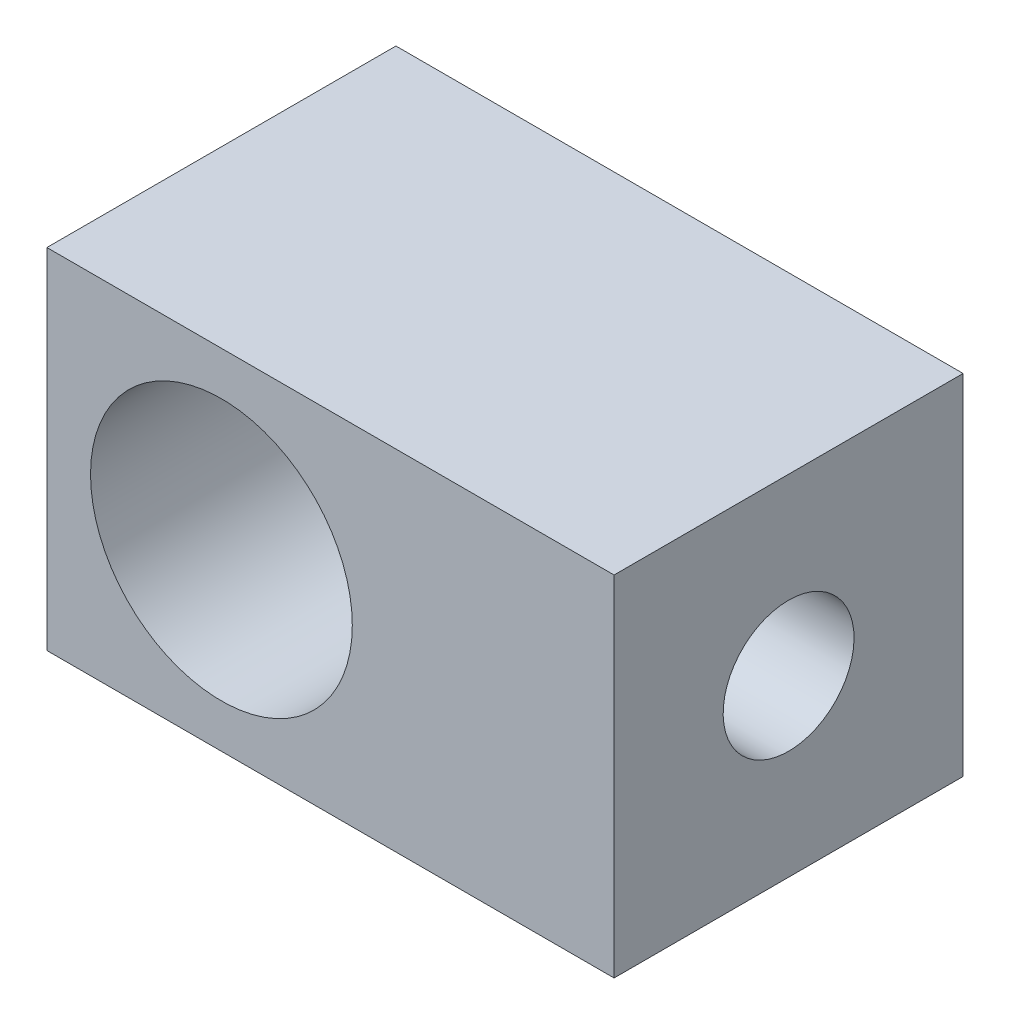
ISO-10303-21;
HEADER;
FILE_DESCRIPTION(('STEP AP214'),'2;1');
FILE_NAME('part.step','',(''),(''),'','','');
FILE_SCHEMA(('AUTOMOTIVE_DESIGN { 1 0 10303 214 1 1 1 1 }'));
ENDSEC;
DATA;
#1=APPLICATION_CONTEXT('core data for automotive mechanical design processes');
#2=APPLICATION_PROTOCOL_DEFINITION('international standard','automotive_design',2000,#1);
#3=PRODUCT_CONTEXT('',#1,'mechanical');
#4=PRODUCT('Part','Part','',(#3));
#5=PRODUCT_RELATED_PRODUCT_CATEGORY('part','',(#4));
#6=PRODUCT_DEFINITION_FORMATION('','',#4);
#7=PRODUCT_DEFINITION_CONTEXT('part definition',#1,'design');
#8=PRODUCT_DEFINITION('design','',#6,#7);
#9=PRODUCT_DEFINITION_SHAPE('','',#8);
#10=(LENGTH_UNIT() NAMED_UNIT(*) SI_UNIT(.MILLI.,.METRE.));
#11=(NAMED_UNIT(*) PLANE_ANGLE_UNIT() SI_UNIT($,.RADIAN.));
#12=(NAMED_UNIT(*) SI_UNIT($,.STERADIAN.) SOLID_ANGLE_UNIT());
#13=UNCERTAINTY_MEASURE_WITH_UNIT(LENGTH_MEASURE(1.E-05),#10,'distance_accuracy_value','');
#14=(GEOMETRIC_REPRESENTATION_CONTEXT(3) GLOBAL_UNCERTAINTY_ASSIGNED_CONTEXT((#13)) GLOBAL_UNIT_ASSIGNED_CONTEXT((#10,
#11,#12)) REPRESENTATION_CONTEXT('',''));
#15=CARTESIAN_POINT('',(0.,0.,0.));
#16=DIRECTION('',(0.,0.,1.));
#17=DIRECTION('',(1.,0.,0.));
#18=AXIS2_PLACEMENT_3D('',#15,#16,#17);
#19=CARTESIAN_POINT('',(4.62132034355964,0.,2.5));
#20=DIRECTION('',(0.707106781186541,-0.707106781186554,0.));
#21=DIRECTION('',(0.707106781186554,0.707106781186541,0.));
#22=AXIS2_PLACEMENT_3D('',#19,#20,#21);
#23=PLANE('',#22);
#24=DIRECTION('',(-0.707106781186554,-0.707106781186541,0.));
#25=VECTOR('',#24,1.);
#26=CARTESIAN_POINT('',(4.62132034355964,0.,2.5));
#27=LINE('',#26,#25);
#28=CARTESIAN_POINT('',(3.12132034355964,-1.5,2.5));
#29=VERTEX_POINT('',#28);
#30=CARTESIAN_POINT('',(2.49999999999998,-2.12132034355964,2.5));
#31=VERTEX_POINT('',#30);
#32=EDGE_CURVE('E254',#29,#31,#27,.T.);
#33=ORIENTED_EDGE('',*,*,#32,.F.);
#34=DIRECTION('',(0.,0.,-1.));
#35=VECTOR('',#34,1.);
#36=CARTESIAN_POINT('',(3.12132034355964,-1.5,2.5));
#37=LINE('',#36,#35);
#38=CARTESIAN_POINT('',(3.12132034355964,-1.5,2.));
#39=VERTEX_POINT('',#38);
#40=EDGE_CURVE('E227',#29,#39,#37,.T.);
#41=ORIENTED_EDGE('',*,*,#40,.T.);
#42=DIRECTION('',(-0.707106781186554,-0.707106781186541,0.));
#43=VECTOR('',#42,1.);
#44=CARTESIAN_POINT('',(2.49999999999998,-2.12132034355964,2.));
#45=LINE('',#44,#43);
#46=CARTESIAN_POINT('',(2.49999999999998,-2.12132034355964,2.));
#47=VERTEX_POINT('',#46);
#48=EDGE_CURVE('E235',#39,#47,#45,.T.);
#49=ORIENTED_EDGE('',*,*,#48,.T.);
#50=DIRECTION('',(0.,0.,-1.));
#51=VECTOR('',#50,1.);
#52=CARTESIAN_POINT('',(2.49999999999998,-2.12132034355964,2.5));
#53=LINE('',#52,#51);
#54=EDGE_CURVE('E272',#31,#47,#53,.T.);
#55=ORIENTED_EDGE('',*,*,#54,.F.);
#56=EDGE_LOOP('',(#33,#41,#49,#55));
#57=FACE_BOUND('',#56,.T.);
#58=ADVANCED_FACE('F33',(#57),#23,.F.);
#59=CARTESIAN_POINT('',(0.378679656440359,0.,2.5));
#60=DIRECTION('',(-0.707106781186554,-0.707106781186541,0.));
#61=DIRECTION('',(0.707106781186541,-0.707106781186554,0.));
#62=AXIS2_PLACEMENT_3D('',#59,#60,#61);
#63=PLANE('',#62);
#64=DIRECTION('',(-0.707106781186541,0.707106781186554,0.));
#65=VECTOR('',#64,1.);
#66=CARTESIAN_POINT('',(0.378679656440359,0.,2.5));
#67=LINE('',#66,#65);
#68=CARTESIAN_POINT('',(1.,-0.621320343559635,2.5));
#69=VERTEX_POINT('',#68);
#70=CARTESIAN_POINT('',(0.378679656440359,0.,2.5));
#71=VERTEX_POINT('',#70);
#72=EDGE_CURVE('E258',#69,#71,#67,.T.);
#73=ORIENTED_EDGE('',*,*,#72,.F.);
#74=DIRECTION('',(0.,0.,-1.));
#75=VECTOR('',#74,1.);
#76=CARTESIAN_POINT('',(1.,-0.621320343559636,2.5));
#77=LINE('',#76,#75);
#78=CARTESIAN_POINT('',(1.,-0.621320343559636,2.));
#79=VERTEX_POINT('',#78);
#80=EDGE_CURVE('E232',#69,#79,#77,.T.);
#81=ORIENTED_EDGE('',*,*,#80,.T.);
#82=DIRECTION('',(-0.707106781186541,0.707106781186554,0.));
#83=VECTOR('',#82,1.);
#84=CARTESIAN_POINT('',(0.378679656440359,0.,2.));
#85=LINE('',#84,#83);
#86=CARTESIAN_POINT('',(0.378679656440359,0.,2.));
#87=VERTEX_POINT('',#86);
#88=EDGE_CURVE('E239',#79,#87,#85,.T.);
#89=ORIENTED_EDGE('',*,*,#88,.T.);
#90=DIRECTION('',(0.,0.,-1.));
#91=VECTOR('',#90,1.);
#92=CARTESIAN_POINT('',(0.378679656440359,0.,2.5));
#93=LINE('',#92,#91);
#94=EDGE_CURVE('E269',#71,#87,#93,.T.);
#95=ORIENTED_EDGE('',*,*,#94,.F.);
#96=EDGE_LOOP('',(#73,#81,#89,#95));
#97=FACE_BOUND('',#96,.T.);
#98=ADVANCED_FACE('F374',(#97),#63,.F.);
#99=CARTESIAN_POINT('',(2.50000000000002,2.12132034355964,2.5));
#100=DIRECTION('',(-0.707106781186541,0.707106781186554,0.));
#101=DIRECTION('',(-0.707106781186554,-0.707106781186541,0.));
#102=AXIS2_PLACEMENT_3D('',#99,#100,#101);
#103=PLANE('',#102);
#104=DIRECTION('',(0.707106781186554,0.707106781186541,0.));
#105=VECTOR('',#104,1.);
#106=CARTESIAN_POINT('',(2.50000000000002,2.12132034355964,2.));
#107=LINE('',#106,#105);
#108=CARTESIAN_POINT('',(1.,0.621320343559651,2.));
#109=VERTEX_POINT('',#108);
#110=EDGE_CURVE('E244',#87,#109,#107,.T.);
#111=ORIENTED_EDGE('',*,*,#110,.T.);
#112=DIRECTION('',(0.,0.,1.));
#113=VECTOR('',#112,1.);
#114=CARTESIAN_POINT('',(1.,0.621320343559651,2.5));
#115=LINE('',#114,#113);
#116=CARTESIAN_POINT('',(1.,0.621320343559651,2.5));
#117=VERTEX_POINT('',#116);
#118=EDGE_CURVE('E230',#109,#117,#115,.T.);
#119=ORIENTED_EDGE('',*,*,#118,.T.);
#120=DIRECTION('',(0.707106781186554,0.707106781186541,0.));
#121=VECTOR('',#120,1.);
#122=CARTESIAN_POINT('',(2.50000000000002,2.12132034355964,2.5));
#123=LINE('',#122,#121);
#124=EDGE_CURVE('E177',#71,#117,#123,.T.);
#125=ORIENTED_EDGE('',*,*,#124,.F.);
#126=ORIENTED_EDGE('',*,*,#94,.T.);
#127=EDGE_LOOP('',(#111,#119,#125,#126));
#128=FACE_BOUND('',#127,.T.);
#129=ADVANCED_FACE('F380',(#128),#103,.F.);
#130=CARTESIAN_POINT('',(2.50000000000002,2.12132034355964,2.5));
#131=DIRECTION('',(0.707106781186554,0.707106781186542,0.));
#132=DIRECTION('',(-0.707106781186542,0.707106781186554,0.));
#133=AXIS2_PLACEMENT_3D('',#130,#131,#132);
#134=PLANE('',#133);
#135=DIRECTION('',(0.707106781186541,-0.707106781186553,0.));
#136=VECTOR('',#135,1.);
#137=CARTESIAN_POINT('',(2.50000000000002,2.12132034355964,2.5));
#138=LINE('',#137,#136);
#139=CARTESIAN_POINT('',(4.,0.621320343559634,2.5));
#140=VERTEX_POINT('',#139);
#141=CARTESIAN_POINT('',(4.62132034355964,0.,2.5));
#142=VERTEX_POINT('',#141);
#143=EDGE_CURVE('E251',#140,#142,#138,.T.);
#144=ORIENTED_EDGE('',*,*,#143,.F.);
#145=DIRECTION('',(0.,0.,-1.));
#146=VECTOR('',#145,1.);
#147=CARTESIAN_POINT('',(4.,0.621320343559635,2.5));
#148=LINE('',#147,#146);
#149=CARTESIAN_POINT('',(4.,0.621320343559635,2.));
#150=VERTEX_POINT('',#149);
#151=EDGE_CURVE('E218',#140,#150,#148,.T.);
#152=ORIENTED_EDGE('',*,*,#151,.T.);
#153=DIRECTION('',(0.707106781186541,-0.707106781186553,0.));
#154=VECTOR('',#153,1.);
#155=CARTESIAN_POINT('',(4.62132034355964,0.,2.));
#156=LINE('',#155,#154);
#157=CARTESIAN_POINT('',(4.62132034355964,0.,2.));
#158=VERTEX_POINT('',#157);
#159=EDGE_CURVE('E247',#150,#158,#156,.T.);
#160=ORIENTED_EDGE('',*,*,#159,.T.);
#161=DIRECTION('',(0.,0.,-1.));
#162=VECTOR('',#161,1.);
#163=CARTESIAN_POINT('',(4.62132034355964,0.,2.5));
#164=LINE('',#163,#162);
#165=EDGE_CURVE('E264',#142,#158,#164,.T.);
#166=ORIENTED_EDGE('',*,*,#165,.F.);
#167=EDGE_LOOP('',(#144,#152,#160,#166));
#168=FACE_BOUND('',#167,.T.);
#169=ADVANCED_FACE('F350',(#168),#134,.F.);
#170=CARTESIAN_POINT('',(0.,0.,2.));
#171=DIRECTION('',(0.,0.,1.));
#172=DIRECTION('',(1.,0.,0.));
#173=AXIS2_PLACEMENT_3D('',#170,#171,#172);
#174=PLANE('',#173);
#175=DIRECTION('',(0.,-1.,0.));
#176=VECTOR('',#175,1.);
#177=CARTESIAN_POINT('',(1.,0.,2.));
#178=LINE('',#177,#176);
#179=EDGE_CURVE('E11',#109,#79,#178,.T.);
#180=ORIENTED_EDGE('',*,*,#179,.F.);
#181=ORIENTED_EDGE('',*,*,#110,.F.);
#182=ORIENTED_EDGE('',*,*,#88,.F.);
#183=EDGE_LOOP('',(#180,#181,#182));
#184=FACE_BOUND('',#183,.T.);
#185=ADVANCED_FACE('F368',(#184),#174,.T.);
#186=DIRECTION('',(1.,0.,0.));
#187=VECTOR('',#186,1.);
#188=CARTESIAN_POINT('',(0.,-1.5,2.));
#189=LINE('',#188,#187);
#190=CARTESIAN_POINT('',(1.87867965644035,-1.5,2.));
#191=VERTEX_POINT('',#190);
#192=EDGE_CURVE('E41',#191,#39,#189,.T.);
#193=ORIENTED_EDGE('',*,*,#192,.F.);
#194=EDGE_CURVE('E240',#47,#191,#85,.T.);
#195=ORIENTED_EDGE('',*,*,#194,.F.);
#196=ORIENTED_EDGE('',*,*,#48,.F.);
#197=EDGE_LOOP('',(#193,#195,#196));
#198=FACE_BOUND('',#197,.T.);
#199=ADVANCED_FACE('F331',(#198),#174,.T.);
#200=DIRECTION('',(0.,1.,0.));
#201=VECTOR('',#200,1.);
#202=CARTESIAN_POINT('',(4.,0.,2.));
#203=LINE('',#202,#201);
#204=CARTESIAN_POINT('',(4.,-0.62132034355965,2.));
#205=VERTEX_POINT('',#204);
#206=EDGE_CURVE('E320',#205,#150,#203,.T.);
#207=ORIENTED_EDGE('',*,*,#206,.F.);
#208=EDGE_CURVE('E236',#158,#205,#45,.T.);
#209=ORIENTED_EDGE('',*,*,#208,.F.);
#210=ORIENTED_EDGE('',*,*,#159,.F.);
#211=EDGE_LOOP('',(#207,#209,#210));
#212=FACE_BOUND('',#211,.T.);
#213=ADVANCED_FACE('F358',(#212),#174,.T.);
#214=CARTESIAN_POINT('',(0.,0.,2.5));
#215=DIRECTION('',(0.,0.,-1.));
#216=DIRECTION('',(-1.,0.,0.));
#217=AXIS2_PLACEMENT_3D('',#214,#215,#216);
#218=PLANE('',#217);
#219=CARTESIAN_POINT('',(2.50000000000002,2.12132034355964,2.5));
#220=VERTEX_POINT('',#219);
#221=CARTESIAN_POINT('',(3.12132034355965,1.5,2.5));
#222=VERTEX_POINT('',#221);
#223=EDGE_CURVE('E252',#220,#222,#138,.T.);
#224=ORIENTED_EDGE('',*,*,#223,.T.);
#225=DIRECTION('',(1.,0.,0.));
#226=VECTOR('',#225,1.);
#227=CARTESIAN_POINT('',(4.,1.5,2.5));
#228=LINE('',#227,#226);
#229=CARTESIAN_POINT('',(4.,1.5,2.5));
#230=VERTEX_POINT('',#229);
#231=EDGE_CURVE('E194',#222,#230,#228,.T.);
#232=ORIENTED_EDGE('',*,*,#231,.T.);
#233=DIRECTION('',(0.,-1.,0.));
#234=VECTOR('',#233,1.);
#235=CARTESIAN_POINT('',(4.,1.5,2.5));
#236=LINE('',#235,#234);
#237=EDGE_CURVE('E196',#230,#140,#236,.T.);
#238=ORIENTED_EDGE('',*,*,#237,.T.);
#239=ORIENTED_EDGE('',*,*,#143,.T.);
#240=CARTESIAN_POINT('',(4.,-0.62132034355965,2.5));
#241=VERTEX_POINT('',#240);
#242=EDGE_CURVE('E255',#142,#241,#27,.T.);
#243=ORIENTED_EDGE('',*,*,#242,.T.);
#244=CARTESIAN_POINT('',(4.,-1.5,2.5));
#245=VERTEX_POINT('',#244);
#246=EDGE_CURVE('E193',#241,#245,#236,.T.);
#247=ORIENTED_EDGE('',*,*,#246,.T.);
#248=DIRECTION('',(-1.,0.,0.));
#249=VECTOR('',#248,1.);
#250=CARTESIAN_POINT('',(4.,-1.5,2.5));
#251=LINE('',#250,#249);
#252=EDGE_CURVE('E188',#245,#29,#251,.T.);
#253=ORIENTED_EDGE('',*,*,#252,.T.);
#254=ORIENTED_EDGE('',*,*,#32,.T.);
#255=CARTESIAN_POINT('',(1.87867965644035,-1.5,2.5));
#256=VERTEX_POINT('',#255);
#257=EDGE_CURVE('E259',#31,#256,#67,.T.);
#258=ORIENTED_EDGE('',*,*,#257,.T.);
#259=CARTESIAN_POINT('',(1.,-1.5,2.5));
#260=VERTEX_POINT('',#259);
#261=EDGE_CURVE('E200',#256,#260,#251,.T.);
#262=ORIENTED_EDGE('',*,*,#261,.T.);
#263=DIRECTION('',(0.,1.,0.));
#264=VECTOR('',#263,1.);
#265=CARTESIAN_POINT('',(1.,1.5,2.5));
#266=LINE('',#265,#264);
#267=EDGE_CURVE('E179',#260,#69,#266,.T.);
#268=ORIENTED_EDGE('',*,*,#267,.T.);
#269=ORIENTED_EDGE('',*,*,#72,.T.);
#270=ORIENTED_EDGE('',*,*,#124,.T.);
#271=CARTESIAN_POINT('',(1.,1.5,2.5));
#272=VERTEX_POINT('',#271);
#273=EDGE_CURVE('E170',#117,#272,#266,.T.);
#274=ORIENTED_EDGE('',*,*,#273,.T.);
#275=CARTESIAN_POINT('',(1.87867965644037,1.5,2.5));
#276=VERTEX_POINT('',#275);
#277=EDGE_CURVE('E174',#272,#276,#228,.T.);
#278=ORIENTED_EDGE('',*,*,#277,.T.);
#279=EDGE_CURVE('E262',#276,#220,#123,.T.);
#280=ORIENTED_EDGE('',*,*,#279,.T.);
#281=EDGE_LOOP('',(#224,#232,#238,#239,#243,#247,#253,#254,#258,#262,#268,#269,#270,#274,#278,#280));
#282=FACE_BOUND('',#281,.T.);
#283=ADVANCED_FACE('F172',(#282),#218,.T.);
#284=ORIENTED_EDGE('',*,*,#208,.T.);
#285=DIRECTION('',(0.,0.,1.));
#286=VECTOR('',#285,1.);
#287=CARTESIAN_POINT('',(4.,-0.62132034355965,2.5));
#288=LINE('',#287,#286);
#289=EDGE_CURVE('E221',#205,#241,#288,.T.);
#290=ORIENTED_EDGE('',*,*,#289,.T.);
#291=ORIENTED_EDGE('',*,*,#242,.F.);
#292=ORIENTED_EDGE('',*,*,#165,.T.);
#293=EDGE_LOOP('',(#284,#290,#291,#292));
#294=FACE_BOUND('',#293,.T.);
#295=ADVANCED_FACE('F355',(#294),#23,.F.);
#296=ORIENTED_EDGE('',*,*,#194,.T.);
#297=DIRECTION('',(0.,0.,1.));
#298=VECTOR('',#297,1.);
#299=CARTESIAN_POINT('',(1.87867965644035,-1.5,2.5));
#300=LINE('',#299,#298);
#301=EDGE_CURVE('E224',#191,#256,#300,.T.);
#302=ORIENTED_EDGE('',*,*,#301,.T.);
#303=ORIENTED_EDGE('',*,*,#257,.F.);
#304=ORIENTED_EDGE('',*,*,#54,.T.);
#305=EDGE_LOOP('',(#296,#302,#303,#304));
#306=FACE_BOUND('',#305,.T.);
#307=ADVANCED_FACE('F334',(#306),#63,.F.);
#308=ORIENTED_EDGE('',*,*,#279,.F.);
#309=DIRECTION('',(0.,0.,-1.));
#310=VECTOR('',#309,1.);
#311=CARTESIAN_POINT('',(1.87867965644037,1.5,2.5));
#312=LINE('',#311,#310);
#313=CARTESIAN_POINT('',(1.87867965644037,1.5,2.));
#314=VERTEX_POINT('',#313);
#315=EDGE_CURVE('E192',#276,#314,#312,.T.);
#316=ORIENTED_EDGE('',*,*,#315,.T.);
#317=CARTESIAN_POINT('',(2.50000000000002,2.12132034355964,2.));
#318=VERTEX_POINT('',#317);
#319=EDGE_CURVE('E243',#314,#318,#107,.T.);
#320=ORIENTED_EDGE('',*,*,#319,.T.);
#321=DIRECTION('',(0.,0.,-1.));
#322=VECTOR('',#321,1.);
#323=CARTESIAN_POINT('',(2.50000000000002,2.12132034355964,2.5));
#324=LINE('',#323,#322);
#325=EDGE_CURVE('E265',#220,#318,#324,.T.);
#326=ORIENTED_EDGE('',*,*,#325,.F.);
#327=EDGE_LOOP('',(#308,#316,#320,#326));
#328=FACE_BOUND('',#327,.T.);
#329=ADVANCED_FACE('F388',(#328),#103,.F.);
#330=CARTESIAN_POINT('',(3.12132034355965,1.5,2.));
#331=VERTEX_POINT('',#330);
#332=EDGE_CURVE('E248',#318,#331,#156,.T.);
#333=ORIENTED_EDGE('',*,*,#332,.T.);
#334=DIRECTION('',(0.,0.,1.));
#335=VECTOR('',#334,1.);
#336=CARTESIAN_POINT('',(3.12132034355965,1.5,2.5));
#337=LINE('',#336,#335);
#338=EDGE_CURVE('E56',#331,#222,#337,.T.);
#339=ORIENTED_EDGE('',*,*,#338,.T.);
#340=ORIENTED_EDGE('',*,*,#223,.F.);
#341=ORIENTED_EDGE('',*,*,#325,.T.);
#342=EDGE_LOOP('',(#333,#339,#340,#341));
#343=FACE_BOUND('',#342,.T.);
#344=ADVANCED_FACE('F371',(#343),#134,.F.);
#345=DIRECTION('',(-1.,0.,0.));
#346=VECTOR('',#345,1.);
#347=CARTESIAN_POINT('',(0.,1.5,2.));
#348=LINE('',#347,#346);
#349=EDGE_CURVE('E318',#331,#314,#348,.T.);
#350=ORIENTED_EDGE('',*,*,#349,.F.);
#351=ORIENTED_EDGE('',*,*,#332,.F.);
#352=ORIENTED_EDGE('',*,*,#319,.F.);
#353=EDGE_LOOP('',(#350,#351,#352));
#354=FACE_BOUND('',#353,.T.);
#355=ADVANCED_FACE('F361',(#354),#174,.T.);
#356=CARTESIAN_POINT('',(1.,1.5,2.5));
#357=DIRECTION('',(-1.,0.,0.));
#358=DIRECTION('',(0.,-1.,0.));
#359=AXIS2_PLACEMENT_3D('',#356,#357,#358);
#360=PLANE('',#359);
#361=ORIENTED_EDGE('',*,*,#267,.F.);
#362=DIRECTION('',(0.,0.,-1.));
#363=VECTOR('',#362,1.);
#364=CARTESIAN_POINT('',(1.,-1.5,2.5));
#365=LINE('',#364,#363);
#366=CARTESIAN_POINT('',(1.,-1.5,0.));
#367=VERTEX_POINT('',#366);
#368=EDGE_CURVE('E211',#260,#367,#365,.T.);
#369=ORIENTED_EDGE('',*,*,#368,.T.);
#370=DIRECTION('',(0.,1.,0.));
#371=VECTOR('',#370,1.);
#372=CARTESIAN_POINT('',(1.,1.5,0.));
#373=LINE('',#372,#371);
#374=CARTESIAN_POINT('',(1.,1.5,0.));
#375=VERTEX_POINT('',#374);
#376=EDGE_CURVE('E48',#367,#375,#373,.T.);
#377=ORIENTED_EDGE('',*,*,#376,.T.);
#378=DIRECTION('',(0.,0.,-1.));
#379=VECTOR('',#378,1.);
#380=CARTESIAN_POINT('',(1.,1.5,2.5));
#381=LINE('',#380,#379);
#382=EDGE_CURVE('E182',#272,#375,#381,.T.);
#383=ORIENTED_EDGE('',*,*,#382,.F.);
#384=ORIENTED_EDGE('',*,*,#273,.F.);
#385=ORIENTED_EDGE('',*,*,#118,.F.);
#386=ORIENTED_EDGE('',*,*,#179,.T.);
#387=ORIENTED_EDGE('',*,*,#80,.F.);
#388=EDGE_LOOP('',(#361,#369,#377,#383,#384,#385,#386,#387));
#389=FACE_BOUND('',#388,.T.);
#390=ADVANCED_FACE('F184',(#389),#360,.F.);
#391=CARTESIAN_POINT('',(4.,-1.5,2.5));
#392=DIRECTION('',(0.,-1.,0.));
#393=DIRECTION('',(0.,0.,-1.));
#394=AXIS2_PLACEMENT_3D('',#391,#392,#393);
#395=PLANE('',#394);
#396=ORIENTED_EDGE('',*,*,#252,.F.);
#397=DIRECTION('',(0.,0.,-1.));
#398=VECTOR('',#397,1.);
#399=CARTESIAN_POINT('',(4.,-1.5,2.5));
#400=LINE('',#399,#398);
#401=CARTESIAN_POINT('',(4.,-1.5,0.));
#402=VERTEX_POINT('',#401);
#403=EDGE_CURVE('E213',#245,#402,#400,.T.);
#404=ORIENTED_EDGE('',*,*,#403,.T.);
#405=DIRECTION('',(-1.,0.,0.));
#406=VECTOR('',#405,1.);
#407=CARTESIAN_POINT('',(4.,-1.5,0.));
#408=LINE('',#407,#406);
#409=EDGE_CURVE('E180',#402,#367,#408,.T.);
#410=ORIENTED_EDGE('',*,*,#409,.T.);
#411=ORIENTED_EDGE('',*,*,#368,.F.);
#412=ORIENTED_EDGE('',*,*,#261,.F.);
#413=ORIENTED_EDGE('',*,*,#301,.F.);
#414=ORIENTED_EDGE('',*,*,#192,.T.);
#415=ORIENTED_EDGE('',*,*,#40,.F.);
#416=EDGE_LOOP('',(#396,#404,#410,#411,#412,#413,#414,#415));
#417=FACE_BOUND('',#416,.T.);
#418=ADVANCED_FACE('F324',(#417),#395,.F.);
#419=CARTESIAN_POINT('',(4.,1.5,2.5));
#420=DIRECTION('',(1.,0.,0.));
#421=DIRECTION('',(0.,0.,-1.));
#422=AXIS2_PLACEMENT_3D('',#419,#420,#421);
#423=PLANE('',#422);
#424=ORIENTED_EDGE('',*,*,#206,.T.);
#425=ORIENTED_EDGE('',*,*,#151,.F.);
#426=ORIENTED_EDGE('',*,*,#237,.F.);
#427=DIRECTION('',(0.,0.,-1.));
#428=VECTOR('',#427,1.);
#429=CARTESIAN_POINT('',(4.,1.5,2.5));
#430=LINE('',#429,#428);
#431=CARTESIAN_POINT('',(4.,1.5,0.));
#432=VERTEX_POINT('',#431);
#433=EDGE_CURVE('E187',#230,#432,#430,.T.);
#434=ORIENTED_EDGE('',*,*,#433,.T.);
#435=DIRECTION('',(0.,-1.,0.));
#436=VECTOR('',#435,1.);
#437=CARTESIAN_POINT('',(4.,1.5,0.));
#438=LINE('',#437,#436);
#439=EDGE_CURVE('E206',#432,#402,#438,.T.);
#440=ORIENTED_EDGE('',*,*,#439,.T.);
#441=ORIENTED_EDGE('',*,*,#403,.F.);
#442=ORIENTED_EDGE('',*,*,#246,.F.);
#443=ORIENTED_EDGE('',*,*,#289,.F.);
#444=EDGE_LOOP('',(#424,#425,#426,#434,#440,#441,#442,#443));
#445=FACE_BOUND('',#444,.T.);
#446=ADVANCED_FACE('F341',(#445),#423,.F.);
#447=CARTESIAN_POINT('',(4.,1.5,2.5));
#448=DIRECTION('',(0.,1.,0.));
#449=DIRECTION('',(0.,0.,1.));
#450=AXIS2_PLACEMENT_3D('',#447,#448,#449);
#451=PLANE('',#450);
#452=ORIENTED_EDGE('',*,*,#277,.F.);
#453=ORIENTED_EDGE('',*,*,#382,.T.);
#454=DIRECTION('',(1.,0.,0.));
#455=VECTOR('',#454,1.);
#456=CARTESIAN_POINT('',(4.,1.5,0.));
#457=LINE('',#456,#455);
#458=EDGE_CURVE('E204',#375,#432,#457,.T.);
#459=ORIENTED_EDGE('',*,*,#458,.T.);
#460=ORIENTED_EDGE('',*,*,#433,.F.);
#461=ORIENTED_EDGE('',*,*,#231,.F.);
#462=ORIENTED_EDGE('',*,*,#338,.F.);
#463=ORIENTED_EDGE('',*,*,#349,.T.);
#464=ORIENTED_EDGE('',*,*,#315,.F.);
#465=EDGE_LOOP('',(#452,#453,#459,#460,#461,#462,#463,#464));
#466=FACE_BOUND('',#465,.T.);
#467=ADVANCED_FACE('F190',(#466),#451,.F.);
#468=CARTESIAN_POINT('',(-4.,4.,8.));
#469=DIRECTION('',(0.,-1.,0.));
#470=DIRECTION('',(0.,0.,-1.));
#471=AXIS2_PLACEMENT_3D('',#468,#469,#470);
#472=PLANE('',#471);
#473=DIRECTION('',(-1.,0.,0.));
#474=VECTOR('',#473,1.);
#475=CARTESIAN_POINT('',(-4.,4.,0.));
#476=LINE('',#475,#474);
#477=CARTESIAN_POINT('',(9.,4.,0.));
#478=VERTEX_POINT('',#477);
#479=CARTESIAN_POINT('',(-4.,4.,0.));
#480=VERTEX_POINT('',#479);
#481=EDGE_CURVE('E298',#478,#480,#476,.T.);
#482=ORIENTED_EDGE('',*,*,#481,.T.);
#483=DIRECTION('',(0.,0.,-1.));
#484=VECTOR('',#483,1.);
#485=CARTESIAN_POINT('',(-4.,4.,8.));
#486=LINE('',#485,#484);
#487=CARTESIAN_POINT('',(-4.,4.,8.));
#488=VERTEX_POINT('',#487);
#489=EDGE_CURVE('E315',#488,#480,#486,.T.);
#490=ORIENTED_EDGE('',*,*,#489,.F.);
#491=DIRECTION('',(-1.,0.,0.));
#492=VECTOR('',#491,1.);
#493=CARTESIAN_POINT('',(-4.,4.,8.));
#494=LINE('',#493,#492);
#495=CARTESIAN_POINT('',(9.,4.,8.));
#496=VERTEX_POINT('',#495);
#497=EDGE_CURVE('E301',#496,#488,#494,.T.);
#498=ORIENTED_EDGE('',*,*,#497,.F.);
#499=DIRECTION('',(0.,0.,1.));
#500=VECTOR('',#499,1.);
#501=CARTESIAN_POINT('',(9.,4.,0.));
#502=LINE('',#501,#500);
#503=EDGE_CURVE('E280',#478,#496,#502,.T.);
#504=ORIENTED_EDGE('',*,*,#503,.F.);
#505=EDGE_LOOP('',(#482,#490,#498,#504));
#506=FACE_BOUND('',#505,.T.);
#507=ADVANCED_FACE('F35',(#506),#472,.F.);
#508=CARTESIAN_POINT('',(-4.,4.,8.));
#509=DIRECTION('',(1.,0.,0.));
#510=DIRECTION('',(0.,1.,0.));
#511=AXIS2_PLACEMENT_3D('',#508,#509,#510);
#512=PLANE('',#511);
#513=DIRECTION('',(0.,-1.,0.));
#514=VECTOR('',#513,1.);
#515=CARTESIAN_POINT('',(-4.,4.,0.));
#516=LINE('',#515,#514);
#517=CARTESIAN_POINT('',(-4.,-4.,0.));
#518=VERTEX_POINT('',#517);
#519=EDGE_CURVE('E310',#480,#518,#516,.T.);
#520=ORIENTED_EDGE('',*,*,#519,.T.);
#521=DIRECTION('',(0.,0.,-1.));
#522=VECTOR('',#521,1.);
#523=CARTESIAN_POINT('',(-4.,-4.,8.));
#524=LINE('',#523,#522);
#525=CARTESIAN_POINT('',(-4.,-4.,8.));
#526=VERTEX_POINT('',#525);
#527=EDGE_CURVE('E308',#526,#518,#524,.T.);
#528=ORIENTED_EDGE('',*,*,#527,.F.);
#529=DIRECTION('',(0.,-1.,0.));
#530=VECTOR('',#529,1.);
#531=CARTESIAN_POINT('',(-4.,4.,8.));
#532=LINE('',#531,#530);
#533=EDGE_CURVE('E303',#488,#526,#532,.T.);
#534=ORIENTED_EDGE('',*,*,#533,.F.);
#535=ORIENTED_EDGE('',*,*,#489,.T.);
#536=EDGE_LOOP('',(#520,#528,#534,#535));
#537=FACE_BOUND('',#536,.T.);
#538=ADVANCED_FACE('F562',(#537),#512,.F.);
#539=CARTESIAN_POINT('',(-4.,-4.,8.));
#540=DIRECTION('',(0.,1.,0.));
#541=DIRECTION('',(0.,0.,1.));
#542=AXIS2_PLACEMENT_3D('',#539,#540,#541);
#543=PLANE('',#542);
#544=DIRECTION('',(1.,0.,0.));
#545=VECTOR('',#544,1.);
#546=CARTESIAN_POINT('',(-4.,-4.,0.));
#547=LINE('',#546,#545);
#548=CARTESIAN_POINT('',(9.,-4.,0.));
#549=VERTEX_POINT('',#548);
#550=EDGE_CURVE('E304',#518,#549,#547,.T.);
#551=ORIENTED_EDGE('',*,*,#550,.T.);
#552=DIRECTION('',(0.,0.,-1.));
#553=VECTOR('',#552,1.);
#554=CARTESIAN_POINT('',(9.,-4.,8.));
#555=LINE('',#554,#553);
#556=CARTESIAN_POINT('',(9.,-4.,8.));
#557=VERTEX_POINT('',#556);
#558=EDGE_CURVE('E288',#557,#549,#555,.T.);
#559=ORIENTED_EDGE('',*,*,#558,.F.);
#560=DIRECTION('',(1.,0.,0.));
#561=VECTOR('',#560,1.);
#562=CARTESIAN_POINT('',(-4.,-4.,8.));
#563=LINE('',#562,#561);
#564=EDGE_CURVE('E306',#526,#557,#563,.T.);
#565=ORIENTED_EDGE('',*,*,#564,.F.);
#566=ORIENTED_EDGE('',*,*,#527,.T.);
#567=EDGE_LOOP('',(#551,#559,#565,#566));
#568=FACE_BOUND('',#567,.T.);
#569=ADVANCED_FACE('F554',(#568),#543,.F.);
#570=CARTESIAN_POINT('',(0.,0.,8.));
#571=DIRECTION('',(0.,0.,1.));
#572=DIRECTION('',(1.,0.,0.));
#573=AXIS2_PLACEMENT_3D('',#570,#571,#572);
#574=PLANE('',#573);
#575=CARTESIAN_POINT('',(0.,0.,8.));
#576=DIRECTION('',(0.,0.,1.));
#577=DIRECTION('',(1.,0.,0.));
#578=AXIS2_PLACEMENT_3D('',#575,#576,#577);
#579=CIRCLE('',#578,3.);
#580=CARTESIAN_POINT('',(3.,0.,8.));
#581=VERTEX_POINT('',#580);
#582=EDGE_CURVE('E294',#581,#581,#579,.T.);
#583=ORIENTED_EDGE('',*,*,#582,.F.);
#584=EDGE_LOOP('',(#583));
#585=FACE_BOUND('',#584,.T.);
#586=ORIENTED_EDGE('',*,*,#564,.T.);
#587=DIRECTION('',(0.,-1.,0.));
#588=VECTOR('',#587,1.);
#589=CARTESIAN_POINT('',(9.,4.,8.));
#590=LINE('',#589,#588);
#591=EDGE_CURVE('E285',#496,#557,#590,.T.);
#592=ORIENTED_EDGE('',*,*,#591,.F.);
#593=ORIENTED_EDGE('',*,*,#497,.T.);
#594=ORIENTED_EDGE('',*,*,#533,.T.);
#595=EDGE_LOOP('',(#586,#592,#593,#594));
#596=FACE_BOUND('',#595,.T.);
#597=ADVANCED_FACE('F474',(#585,#596),#574,.T.);
#598=CARTESIAN_POINT('',(0.,0.,0.));
#599=DIRECTION('',(0.,0.,1.));
#600=DIRECTION('',(1.,0.,0.));
#601=AXIS2_PLACEMENT_3D('',#598,#599,#600);
#602=PLANE('',#601);
#603=ORIENTED_EDGE('',*,*,#458,.F.);
#604=ORIENTED_EDGE('',*,*,#376,.F.);
#605=ORIENTED_EDGE('',*,*,#409,.F.);
#606=ORIENTED_EDGE('',*,*,#439,.F.);
#607=EDGE_LOOP('',(#603,#604,#605,#606));
#608=FACE_BOUND('',#607,.T.);
#609=ORIENTED_EDGE('',*,*,#481,.F.);
#610=DIRECTION('',(0.,1.,0.));
#611=VECTOR('',#610,1.);
#612=CARTESIAN_POINT('',(9.,-4.,0.));
#613=LINE('',#612,#611);
#614=EDGE_CURVE('E291',#549,#478,#613,.T.);
#615=ORIENTED_EDGE('',*,*,#614,.F.);
#616=ORIENTED_EDGE('',*,*,#550,.F.);
#617=ORIENTED_EDGE('',*,*,#519,.F.);
#618=EDGE_LOOP('',(#609,#615,#616,#617));
#619=FACE_BOUND('',#618,.T.);
#620=ADVANCED_FACE('F345',(#608,#619),#602,.F.);
#621=CARTESIAN_POINT('',(0.,0.,3.));
#622=DIRECTION('',(0.,0.,1.));
#623=DIRECTION('',(1.,0.,0.));
#624=AXIS2_PLACEMENT_3D('',#621,#622,#623);
#625=CYLINDRICAL_SURFACE('',#624,3.);
#626=CARTESIAN_POINT('',(0.,0.,3.));
#627=DIRECTION('',(0.,0.,1.));
#628=DIRECTION('',(1.,0.,0.));
#629=AXIS2_PLACEMENT_3D('',#626,#627,#628);
#630=CIRCLE('',#629,3.);
#631=CARTESIAN_POINT('',(3.,0.,3.));
#632=VERTEX_POINT('',#631);
#633=EDGE_CURVE('E295',#632,#632,#630,.T.);
#634=ORIENTED_EDGE('',*,*,#633,.F.);
#635=EDGE_LOOP('',(#634));
#636=FACE_BOUND('',#635,.T.);
#637=ORIENTED_EDGE('',*,*,#582,.T.);
#638=EDGE_LOOP('',(#637));
#639=FACE_BOUND('',#638,.T.);
#640=ADVANCED_FACE('F473',(#636,#639),#625,.F.);
#641=CARTESIAN_POINT('',(0.,0.,3.));
#642=DIRECTION('',(0.,0.,1.));
#643=DIRECTION('',(1.,0.,0.));
#644=AXIS2_PLACEMENT_3D('',#641,#642,#643);
#645=PLANE('',#644);
#646=ORIENTED_EDGE('',*,*,#633,.T.);
#647=EDGE_LOOP('',(#646));
#648=FACE_BOUND('',#647,.T.);
#649=ADVANCED_FACE('F530',(#648),#645,.T.);
#650=CARTESIAN_POINT('',(9.,0.,0.));
#651=DIRECTION('',(1.,0.,0.));
#652=DIRECTION('',(0.,1.,0.));
#653=AXIS2_PLACEMENT_3D('',#650,#651,#652);
#654=PLANE('',#653);
#655=CARTESIAN_POINT('',(9.,0.,4.));
#656=DIRECTION('',(1.,0.,0.));
#657=DIRECTION('',(0.,1.,0.));
#658=AXIS2_PLACEMENT_3D('',#655,#656,#657);
#659=CIRCLE('',#658,1.5);
#660=CARTESIAN_POINT('',(9.,1.5,4.));
#661=VERTEX_POINT('',#660);
#662=EDGE_CURVE('E268',#661,#661,#659,.T.);
#663=ORIENTED_EDGE('',*,*,#662,.F.);
#664=EDGE_LOOP('',(#663));
#665=FACE_BOUND('',#664,.T.);
#666=ORIENTED_EDGE('',*,*,#503,.T.);
#667=ORIENTED_EDGE('',*,*,#591,.T.);
#668=ORIENTED_EDGE('',*,*,#558,.T.);
#669=ORIENTED_EDGE('',*,*,#614,.T.);
#670=EDGE_LOOP('',(#666,#667,#668,#669));
#671=FACE_BOUND('',#670,.T.);
#672=ADVANCED_FACE('F522',(#665,#671),#654,.T.);
#673=CARTESIAN_POINT('',(5.,0.,4.));
#674=DIRECTION('',(1.,0.,0.));
#675=DIRECTION('',(0.,1.,0.));
#676=AXIS2_PLACEMENT_3D('',#673,#674,#675);
#677=CYLINDRICAL_SURFACE('',#676,1.5);
#678=CARTESIAN_POINT('',(5.,0.,4.));
#679=DIRECTION('',(1.,0.,0.));
#680=DIRECTION('',(0.,1.,0.));
#681=AXIS2_PLACEMENT_3D('',#678,#679,#680);
#682=CIRCLE('',#681,1.5);
#683=CARTESIAN_POINT('',(5.,1.5,4.));
#684=VERTEX_POINT('',#683);
#685=EDGE_CURVE('E277',#684,#684,#682,.T.);
#686=ORIENTED_EDGE('',*,*,#685,.F.);
#687=EDGE_LOOP('',(#686));
#688=FACE_BOUND('',#687,.T.);
#689=ORIENTED_EDGE('',*,*,#662,.T.);
#690=EDGE_LOOP('',(#689));
#691=FACE_BOUND('',#690,.T.);
#692=ADVANCED_FACE('F515',(#688,#691),#677,.F.);
#693=CARTESIAN_POINT('',(5.,0.,4.));
#694=DIRECTION('',(1.,0.,0.));
#695=DIRECTION('',(0.,1.,0.));
#696=AXIS2_PLACEMENT_3D('',#693,#694,#695);
#697=PLANE('',#696);
#698=ORIENTED_EDGE('',*,*,#685,.T.);
#699=EDGE_LOOP('',(#698));
#700=FACE_BOUND('',#699,.T.);
#701=ADVANCED_FACE('F512',(#700),#697,.T.);
#702=CLOSED_SHELL('',(#58,#98,#129,#169,#185,#199,#213,#283,#295,#307,#329,#344,#355,#390,#418,
#446,#467,#507,#538,#569,#597,#620,#640,#649,#672,#692,#701));
#703=MANIFOLD_SOLID_BREP('B2',#702);
#704=ADVANCED_BREP_SHAPE_REPRESENTATION('',(#18,#703),#14);
#705=SHAPE_DEFINITION_REPRESENTATION(#9,#704);
ENDSEC;
END-ISO-10303-21;
